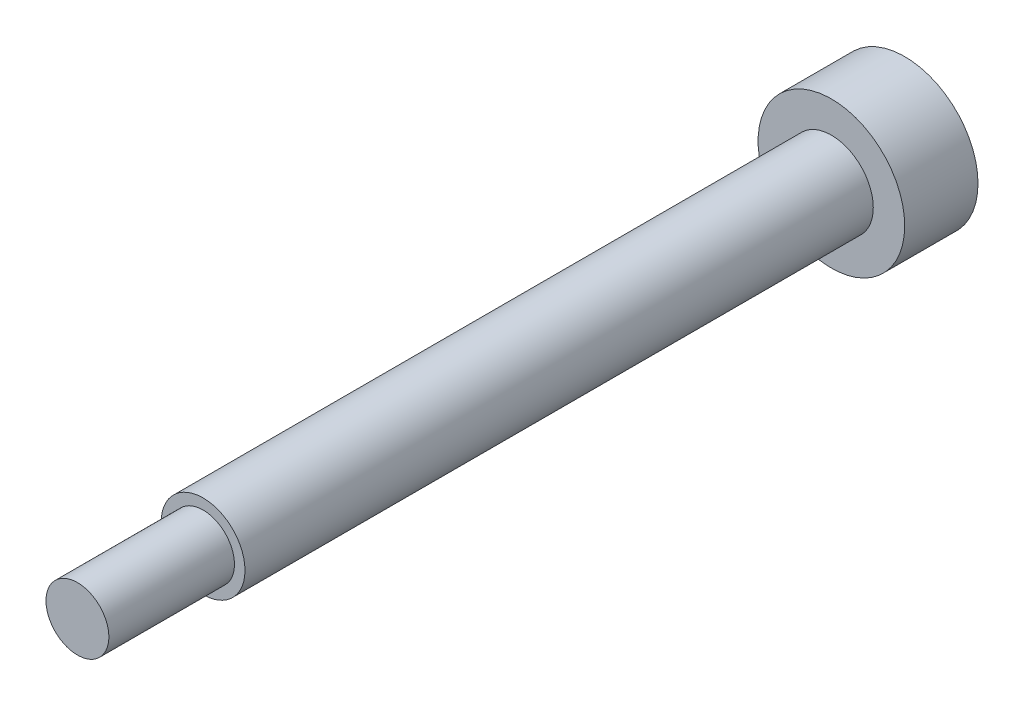
ISO-10303-21;
HEADER;
FILE_DESCRIPTION(('STEP AP214'),'2;1');
FILE_NAME('part.step','',(''),(''),'','','');
FILE_SCHEMA(('AUTOMOTIVE_DESIGN { 1 0 10303 214 1 1 1 1 }'));
ENDSEC;
DATA;
#1=APPLICATION_CONTEXT('core data for automotive mechanical design processes');
#2=APPLICATION_PROTOCOL_DEFINITION('international standard','automotive_design',2000,#1);
#3=PRODUCT_CONTEXT('',#1,'mechanical');
#4=PRODUCT('Part','Part','',(#3));
#5=PRODUCT_RELATED_PRODUCT_CATEGORY('part','',(#4));
#6=PRODUCT_DEFINITION_FORMATION('','',#4);
#7=PRODUCT_DEFINITION_CONTEXT('part definition',#1,'design');
#8=PRODUCT_DEFINITION('design','',#6,#7);
#9=PRODUCT_DEFINITION_SHAPE('','',#8);
#10=(LENGTH_UNIT() NAMED_UNIT(*) SI_UNIT(.MILLI.,.METRE.));
#11=(NAMED_UNIT(*) PLANE_ANGLE_UNIT() SI_UNIT($,.RADIAN.));
#12=(NAMED_UNIT(*) SI_UNIT($,.STERADIAN.) SOLID_ANGLE_UNIT());
#13=UNCERTAINTY_MEASURE_WITH_UNIT(LENGTH_MEASURE(1.E-05),#10,'distance_accuracy_value','');
#14=(GEOMETRIC_REPRESENTATION_CONTEXT(3) GLOBAL_UNCERTAINTY_ASSIGNED_CONTEXT((#13)) GLOBAL_UNIT_ASSIGNED_CONTEXT((#10,
#11,#12)) REPRESENTATION_CONTEXT('',''));
#15=CARTESIAN_POINT('',(0.,0.,0.));
#16=DIRECTION('',(0.,0.,1.));
#17=DIRECTION('',(1.,0.,0.));
#18=AXIS2_PLACEMENT_3D('',#15,#16,#17);
#19=CARTESIAN_POINT('',(0.,0.,-3.5));
#20=DIRECTION('',(0.,0.,1.));
#21=DIRECTION('',(-1.,0.,0.));
#22=AXIS2_PLACEMENT_3D('',#19,#20,#21);
#23=CYLINDRICAL_SURFACE('',#22,3.5);
#24=CARTESIAN_POINT('',(0.,0.,-3.5));
#25=DIRECTION('',(0.,0.,1.));
#26=DIRECTION('',(1.,0.,0.));
#27=AXIS2_PLACEMENT_3D('',#24,#25,#26);
#28=CIRCLE('',#27,3.5);
#29=CARTESIAN_POINT('',(3.5,0.,-3.5));
#30=VERTEX_POINT('',#29);
#31=EDGE_CURVE('E46',#30,#30,#28,.T.);
#32=ORIENTED_EDGE('',*,*,#31,.T.);
#33=EDGE_LOOP('',(#32));
#34=FACE_BOUND('',#33,.T.);
#35=CARTESIAN_POINT('',(0.,0.,0.));
#36=DIRECTION('',(0.,0.,1.));
#37=DIRECTION('',(1.,0.,0.));
#38=AXIS2_PLACEMENT_3D('',#35,#36,#37);
#39=CIRCLE('',#38,3.5);
#40=CARTESIAN_POINT('',(3.5,0.,0.));
#41=VERTEX_POINT('',#40);
#42=EDGE_CURVE('E129',#41,#41,#39,.T.);
#43=ORIENTED_EDGE('',*,*,#42,.F.);
#44=EDGE_LOOP('',(#43));
#45=FACE_BOUND('',#44,.T.);
#46=ADVANCED_FACE('F39',(#34,#45),#23,.T.);
#47=CARTESIAN_POINT('',(0.,0.,-3.5));
#48=DIRECTION('',(0.,0.,-1.));
#49=DIRECTION('',(1.,0.,0.));
#50=AXIS2_PLACEMENT_3D('',#47,#48,#49);
#51=PLANE('',#50);
#52=DIRECTION('',(-0.483885708586405,0.875131202178183,0.));
#53=VECTOR('',#52,1.);
#54=CARTESIAN_POINT('',(1.73175411943134,-0.0320572898511147,-3.5));
#55=LINE('',#54,#53);
#56=CARTESIAN_POINT('',(1.73175411943134,-0.0320572898511147,-3.5));
#57=VERTEX_POINT('',#56);
#58=CARTESIAN_POINT('',(0.893639487103215,1.48371441561033,-3.5));
#59=VERTEX_POINT('',#58);
#60=EDGE_CURVE('E146',#57,#59,#55,.T.);
#61=ORIENTED_EDGE('',*,*,#60,.T.);
#62=DIRECTION('',(-0.999828707023925,0.0185082849250311,0.));
#63=VECTOR('',#62,1.);
#64=CARTESIAN_POINT('',(0.893639487103215,1.48371441561033,-3.5));
#65=LINE('',#64,#63);
#66=CARTESIAN_POINT('',(-0.838114632328121,1.51577170546145,-3.5));
#67=VERTEX_POINT('',#66);
#68=EDGE_CURVE('E143',#59,#67,#65,.T.);
#69=ORIENTED_EDGE('',*,*,#68,.T.);
#70=DIRECTION('',(-0.51594299843752,-0.856622917253152,0.));
#71=VECTOR('',#70,1.);
#72=CARTESIAN_POINT('',(-0.838114632328121,1.51577170546145,-3.5));
#73=LINE('',#72,#71);
#74=CARTESIAN_POINT('',(-1.73175411943134,0.0320572898511147,-3.5));
#75=VERTEX_POINT('',#74);
#76=EDGE_CURVE('E140',#67,#75,#73,.T.);
#77=ORIENTED_EDGE('',*,*,#76,.T.);
#78=DIRECTION('',(0.483885708586405,-0.875131202178183,0.));
#79=VECTOR('',#78,1.);
#80=CARTESIAN_POINT('',(-1.73175411943134,0.0320572898511147,-3.5));
#81=LINE('',#80,#79);
#82=CARTESIAN_POINT('',(-0.893639487103214,-1.48371441561033,-3.5));
#83=VERTEX_POINT('',#82);
#84=EDGE_CURVE('E138',#75,#83,#81,.T.);
#85=ORIENTED_EDGE('',*,*,#84,.T.);
#86=DIRECTION('',(0.999828707023925,-0.0185082849250311,0.));
#87=VECTOR('',#86,1.);
#88=CARTESIAN_POINT('',(-0.893639487103214,-1.48371441561033,-3.5));
#89=LINE('',#88,#87);
#90=CARTESIAN_POINT('',(0.838114632328121,-1.51577170546145,-3.5));
#91=VERTEX_POINT('',#90);
#92=EDGE_CURVE('E117',#83,#91,#89,.T.);
#93=ORIENTED_EDGE('',*,*,#92,.T.);
#94=DIRECTION('',(0.51594299843752,0.856622917253152,0.));
#95=VECTOR('',#94,1.);
#96=CARTESIAN_POINT('',(0.838114632328121,-1.51577170546145,-3.5));
#97=LINE('',#96,#95);
#98=EDGE_CURVE('E134',#91,#57,#97,.T.);
#99=ORIENTED_EDGE('',*,*,#98,.T.);
#100=EDGE_LOOP('',(#61,#69,#77,#85,#93,#99));
#101=FACE_BOUND('',#100,.T.);
#102=ORIENTED_EDGE('',*,*,#31,.F.);
#103=EDGE_LOOP('',(#102));
#104=FACE_BOUND('',#103,.T.);
#105=ADVANCED_FACE('F175',(#101,#104),#51,.T.);
#106=CARTESIAN_POINT('',(0.,0.,0.));
#107=DIRECTION('',(0.,0.,-1.));
#108=DIRECTION('',(1.,0.,0.));
#109=AXIS2_PLACEMENT_3D('',#106,#107,#108);
#110=PLANE('',#109);
#111=CARTESIAN_POINT('',(0.,0.,0.));
#112=DIRECTION('',(0.,0.,1.));
#113=DIRECTION('',(1.,0.,0.));
#114=AXIS2_PLACEMENT_3D('',#111,#112,#113);
#115=CIRCLE('',#114,2.);
#116=CARTESIAN_POINT('',(2.,0.,0.));
#117=VERTEX_POINT('',#116);
#118=EDGE_CURVE('E11',#117,#117,#115,.F.);
#119=ORIENTED_EDGE('',*,*,#118,.T.);
#120=EDGE_LOOP('',(#119));
#121=FACE_BOUND('',#120,.T.);
#122=ORIENTED_EDGE('',*,*,#42,.T.);
#123=EDGE_LOOP('',(#122));
#124=FACE_BOUND('',#123,.T.);
#125=ADVANCED_FACE('F180',(#121,#124),#110,.F.);
#126=CARTESIAN_POINT('',(1.73175411943134,-0.0320572898511147,-1.5));
#127=DIRECTION('',(0.875131202178183,0.483885708586405,0.));
#128=DIRECTION('',(-0.483885708586405,0.875131202178183,0.));
#129=AXIS2_PLACEMENT_3D('',#126,#127,#128);
#130=PLANE('',#129);
#131=ORIENTED_EDGE('',*,*,#60,.F.);
#132=DIRECTION('',(0.,0.,-1.));
#133=VECTOR('',#132,1.);
#134=CARTESIAN_POINT('',(1.73175411943134,-0.0320572898511147,-1.5));
#135=LINE('',#134,#133);
#136=CARTESIAN_POINT('',(1.73175411943134,-0.0320572898511147,-1.5));
#137=VERTEX_POINT('',#136);
#138=EDGE_CURVE('E84',#137,#57,#135,.T.);
#139=ORIENTED_EDGE('',*,*,#138,.F.);
#140=DIRECTION('',(-0.483885708586405,0.875131202178183,0.));
#141=VECTOR('',#140,1.);
#142=CARTESIAN_POINT('',(1.73175411943134,-0.0320572898511147,-1.5));
#143=LINE('',#142,#141);
#144=CARTESIAN_POINT('',(0.893639487103215,1.48371441561033,-1.5));
#145=VERTEX_POINT('',#144);
#146=EDGE_CURVE('E136',#137,#145,#143,.T.);
#147=ORIENTED_EDGE('',*,*,#146,.T.);
#148=DIRECTION('',(0.,0.,-1.));
#149=VECTOR('',#148,1.);
#150=CARTESIAN_POINT('',(0.893639487103215,1.48371441561033,-1.5));
#151=LINE('',#150,#149);
#152=EDGE_CURVE('E53',#145,#59,#151,.T.);
#153=ORIENTED_EDGE('',*,*,#152,.T.);
#154=EDGE_LOOP('',(#131,#139,#147,#153));
#155=FACE_BOUND('',#154,.T.);
#156=ADVANCED_FACE('F189',(#155),#130,.F.);
#157=CARTESIAN_POINT('',(0.838114632328121,-1.51577170546145,-1.5));
#158=DIRECTION('',(0.856622917253152,-0.51594299843752,0.));
#159=DIRECTION('',(0.51594299843752,0.856622917253153,0.));
#160=AXIS2_PLACEMENT_3D('',#157,#158,#159);
#161=PLANE('',#160);
#162=ORIENTED_EDGE('',*,*,#98,.F.);
#163=DIRECTION('',(0.,0.,-1.));
#164=VECTOR('',#163,1.);
#165=CARTESIAN_POINT('',(0.838114632328121,-1.51577170546145,-1.5));
#166=LINE('',#165,#164);
#167=CARTESIAN_POINT('',(0.838114632328121,-1.51577170546145,-1.5));
#168=VERTEX_POINT('',#167);
#169=EDGE_CURVE('E119',#168,#91,#166,.T.);
#170=ORIENTED_EDGE('',*,*,#169,.F.);
#171=DIRECTION('',(0.51594299843752,0.856622917253152,0.));
#172=VECTOR('',#171,1.);
#173=CARTESIAN_POINT('',(0.838114632328121,-1.51577170546145,-1.5));
#174=LINE('',#173,#172);
#175=EDGE_CURVE('E62',#168,#137,#174,.T.);
#176=ORIENTED_EDGE('',*,*,#175,.T.);
#177=ORIENTED_EDGE('',*,*,#138,.T.);
#178=EDGE_LOOP('',(#162,#170,#176,#177));
#179=FACE_BOUND('',#178,.T.);
#180=ADVANCED_FACE('F194',(#179),#161,.F.);
#181=CARTESIAN_POINT('',(-0.893639487103214,-1.48371441561033,-1.5));
#182=DIRECTION('',(-0.0185082849250311,-0.999828707023925,0.));
#183=DIRECTION('',(0.999828707023925,-0.0185082849250311,0.));
#184=AXIS2_PLACEMENT_3D('',#181,#182,#183);
#185=PLANE('',#184);
#186=ORIENTED_EDGE('',*,*,#92,.F.);
#187=DIRECTION('',(0.,0.,-1.));
#188=VECTOR('',#187,1.);
#189=CARTESIAN_POINT('',(-0.893639487103214,-1.48371441561033,-1.5));
#190=LINE('',#189,#188);
#191=CARTESIAN_POINT('',(-0.893639487103214,-1.48371441561033,-1.5));
#192=VERTEX_POINT('',#191);
#193=EDGE_CURVE('E106',#192,#83,#190,.T.);
#194=ORIENTED_EDGE('',*,*,#193,.F.);
#195=DIRECTION('',(0.999828707023925,-0.0185082849250311,0.));
#196=VECTOR('',#195,1.);
#197=CARTESIAN_POINT('',(-0.893639487103214,-1.48371441561033,-1.5));
#198=LINE('',#197,#196);
#199=EDGE_CURVE('E109',#192,#168,#198,.T.);
#200=ORIENTED_EDGE('',*,*,#199,.T.);
#201=ORIENTED_EDGE('',*,*,#169,.T.);
#202=EDGE_LOOP('',(#186,#194,#200,#201));
#203=FACE_BOUND('',#202,.T.);
#204=ADVANCED_FACE('F115',(#203),#185,.F.);
#205=CARTESIAN_POINT('',(-1.73175411943134,0.0320572898511147,-1.5));
#206=DIRECTION('',(-0.875131202178183,-0.483885708586405,0.));
#207=DIRECTION('',(0.483885708586405,-0.875131202178183,0.));
#208=AXIS2_PLACEMENT_3D('',#205,#206,#207);
#209=PLANE('',#208);
#210=ORIENTED_EDGE('',*,*,#84,.F.);
#211=DIRECTION('',(0.,0.,-1.));
#212=VECTOR('',#211,1.);
#213=CARTESIAN_POINT('',(-1.73175411943134,0.0320572898511147,-1.5));
#214=LINE('',#213,#212);
#215=CARTESIAN_POINT('',(-1.73175411943134,0.0320572898511147,-1.5));
#216=VERTEX_POINT('',#215);
#217=EDGE_CURVE('E108',#216,#75,#214,.T.);
#218=ORIENTED_EDGE('',*,*,#217,.F.);
#219=DIRECTION('',(0.483885708586405,-0.875131202178183,0.));
#220=VECTOR('',#219,1.);
#221=CARTESIAN_POINT('',(-1.73175411943134,0.0320572898511147,-1.5));
#222=LINE('',#221,#220);
#223=EDGE_CURVE('E101',#216,#192,#222,.T.);
#224=ORIENTED_EDGE('',*,*,#223,.T.);
#225=ORIENTED_EDGE('',*,*,#193,.T.);
#226=EDGE_LOOP('',(#210,#218,#224,#225));
#227=FACE_BOUND('',#226,.T.);
#228=ADVANCED_FACE('F104',(#227),#209,.F.);
#229=CARTESIAN_POINT('',(-0.838114632328121,1.51577170546145,-1.5));
#230=DIRECTION('',(-0.856622917253152,0.51594299843752,0.));
#231=DIRECTION('',(-0.51594299843752,-0.856622917253153,0.));
#232=AXIS2_PLACEMENT_3D('',#229,#230,#231);
#233=PLANE('',#232);
#234=ORIENTED_EDGE('',*,*,#76,.F.);
#235=DIRECTION('',(0.,0.,-1.));
#236=VECTOR('',#235,1.);
#237=CARTESIAN_POINT('',(-0.838114632328121,1.51577170546145,-1.5));
#238=LINE('',#237,#236);
#239=CARTESIAN_POINT('',(-0.838114632328121,1.51577170546145,-1.5));
#240=VERTEX_POINT('',#239);
#241=EDGE_CURVE('E122',#240,#67,#238,.T.);
#242=ORIENTED_EDGE('',*,*,#241,.F.);
#243=DIRECTION('',(-0.51594299843752,-0.856622917253152,0.));
#244=VECTOR('',#243,1.);
#245=CARTESIAN_POINT('',(-0.838114632328121,1.51577170546145,-1.5));
#246=LINE('',#245,#244);
#247=EDGE_CURVE('E110',#240,#216,#246,.T.);
#248=ORIENTED_EDGE('',*,*,#247,.T.);
#249=ORIENTED_EDGE('',*,*,#217,.T.);
#250=EDGE_LOOP('',(#234,#242,#248,#249));
#251=FACE_BOUND('',#250,.T.);
#252=ADVANCED_FACE('F198',(#251),#233,.F.);
#253=CARTESIAN_POINT('',(0.893639487103215,1.48371441561033,-1.5));
#254=DIRECTION('',(0.0185082849250311,0.999828707023925,0.));
#255=DIRECTION('',(-0.999828707023925,0.0185082849250311,0.));
#256=AXIS2_PLACEMENT_3D('',#253,#254,#255);
#257=PLANE('',#256);
#258=ORIENTED_EDGE('',*,*,#68,.F.);
#259=ORIENTED_EDGE('',*,*,#152,.F.);
#260=DIRECTION('',(-0.999828707023925,0.0185082849250311,0.));
#261=VECTOR('',#260,1.);
#262=CARTESIAN_POINT('',(0.893639487103215,1.48371441561033,-1.5));
#263=LINE('',#262,#261);
#264=EDGE_CURVE('E92',#145,#240,#263,.T.);
#265=ORIENTED_EDGE('',*,*,#264,.T.);
#266=ORIENTED_EDGE('',*,*,#241,.T.);
#267=EDGE_LOOP('',(#258,#259,#265,#266));
#268=FACE_BOUND('',#267,.T.);
#269=ADVANCED_FACE('F195',(#268),#257,.F.);
#270=CARTESIAN_POINT('',(0.,0.,-1.5));
#271=DIRECTION('',(0.,0.,-1.));
#272=DIRECTION('',(1.,0.,0.));
#273=AXIS2_PLACEMENT_3D('',#270,#271,#272);
#274=PLANE('',#273);
#275=ORIENTED_EDGE('',*,*,#146,.F.);
#276=ORIENTED_EDGE('',*,*,#175,.F.);
#277=ORIENTED_EDGE('',*,*,#199,.F.);
#278=ORIENTED_EDGE('',*,*,#223,.F.);
#279=ORIENTED_EDGE('',*,*,#247,.F.);
#280=ORIENTED_EDGE('',*,*,#264,.F.);
#281=EDGE_LOOP('',(#275,#276,#277,#278,#279,#280));
#282=FACE_BOUND('',#281,.T.);
#283=ADVANCED_FACE('F112',(#282),#274,.T.);
#284=CARTESIAN_POINT('',(0.,0.,30.));
#285=DIRECTION('',(0.,0.,-1.));
#286=DIRECTION('',(1.,0.,0.));
#287=AXIS2_PLACEMENT_3D('',#284,#285,#286);
#288=CYLINDRICAL_SURFACE('',#287,2.);
#289=CARTESIAN_POINT('',(0.,0.,30.));
#290=DIRECTION('',(0.,0.,-1.));
#291=DIRECTION('',(-1.,0.,0.));
#292=AXIS2_PLACEMENT_3D('',#289,#290,#291);
#293=CIRCLE('',#292,2.);
#294=CARTESIAN_POINT('',(-2.,0.,30.));
#295=VERTEX_POINT('',#294);
#296=EDGE_CURVE('E149',#295,#295,#293,.T.);
#297=ORIENTED_EDGE('',*,*,#296,.T.);
#298=EDGE_LOOP('',(#297));
#299=FACE_BOUND('',#298,.T.);
#300=ORIENTED_EDGE('',*,*,#118,.F.);
#301=EDGE_LOOP('',(#300));
#302=FACE_BOUND('',#301,.T.);
#303=ADVANCED_FACE('F211',(#299,#302),#288,.T.);
#304=CARTESIAN_POINT('',(0.,0.,30.));
#305=DIRECTION('',(0.,0.,1.));
#306=DIRECTION('',(-1.,0.,0.));
#307=AXIS2_PLACEMENT_3D('',#304,#305,#306);
#308=PLANE('',#307);
#309=CARTESIAN_POINT('',(0.,0.,30.));
#310=DIRECTION('',(0.,0.,-1.));
#311=DIRECTION('',(-1.,0.,0.));
#312=AXIS2_PLACEMENT_3D('',#309,#310,#311);
#313=CIRCLE('',#312,1.5);
#314=CARTESIAN_POINT('',(-1.5,0.,30.));
#315=VERTEX_POINT('',#314);
#316=EDGE_CURVE('E157',#315,#315,#313,.T.);
#317=ORIENTED_EDGE('',*,*,#316,.T.);
#318=EDGE_LOOP('',(#317));
#319=FACE_BOUND('',#318,.T.);
#320=ORIENTED_EDGE('',*,*,#296,.F.);
#321=EDGE_LOOP('',(#320));
#322=FACE_BOUND('',#321,.T.);
#323=ADVANCED_FACE('F172',(#319,#322),#308,.T.);
#324=CARTESIAN_POINT('',(0.,0.,36.));
#325=DIRECTION('',(0.,0.,-1.));
#326=DIRECTION('',(1.,0.,0.));
#327=AXIS2_PLACEMENT_3D('',#324,#325,#326);
#328=CYLINDRICAL_SURFACE('',#327,1.5);
#329=CARTESIAN_POINT('',(0.,0.,36.));
#330=DIRECTION('',(0.,0.,-1.));
#331=DIRECTION('',(-1.,0.,0.));
#332=AXIS2_PLACEMENT_3D('',#329,#330,#331);
#333=CIRCLE('',#332,1.5);
#334=CARTESIAN_POINT('',(-1.5,0.,36.));
#335=VERTEX_POINT('',#334);
#336=EDGE_CURVE('E156',#335,#335,#333,.T.);
#337=ORIENTED_EDGE('',*,*,#336,.T.);
#338=EDGE_LOOP('',(#337));
#339=FACE_BOUND('',#338,.T.);
#340=ORIENTED_EDGE('',*,*,#316,.F.);
#341=EDGE_LOOP('',(#340));
#342=FACE_BOUND('',#341,.T.);
#343=ADVANCED_FACE('F163',(#339,#342),#328,.T.);
#344=CARTESIAN_POINT('',(0.,0.,36.));
#345=DIRECTION('',(0.,0.,1.));
#346=DIRECTION('',(-1.,0.,0.));
#347=AXIS2_PLACEMENT_3D('',#344,#345,#346);
#348=PLANE('',#347);
#349=ORIENTED_EDGE('',*,*,#336,.F.);
#350=EDGE_LOOP('',(#349));
#351=FACE_BOUND('',#350,.T.);
#352=ADVANCED_FACE('F166',(#351),#348,.T.);
#353=CLOSED_SHELL('',(#46,#105,#125,#156,#180,#204,#228,#252,#269,#283,#303,#323,#343,#352));
#354=MANIFOLD_SOLID_BREP('B2',#353);
#355=ADVANCED_BREP_SHAPE_REPRESENTATION('',(#18,#354),#14);
#356=SHAPE_DEFINITION_REPRESENTATION(#9,#355);
ENDSEC;
END-ISO-10303-21;
